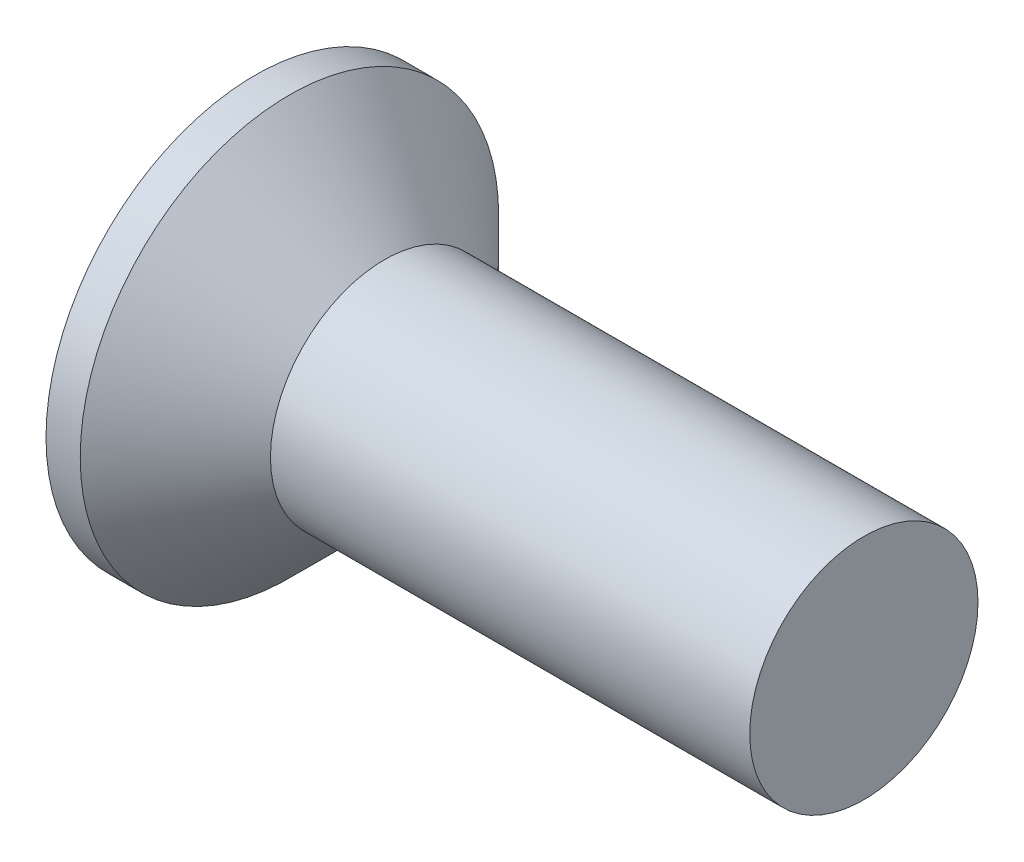
ISO-10303-21;
HEADER;
FILE_DESCRIPTION(('STEP AP214'),'2;1');
FILE_NAME('part.step','',(''),(''),'','','');
FILE_SCHEMA(('AUTOMOTIVE_DESIGN { 1 0 10303 214 1 1 1 1 }'));
ENDSEC;
DATA;
#1=APPLICATION_CONTEXT('core data for automotive mechanical design processes');
#2=APPLICATION_PROTOCOL_DEFINITION('international standard','automotive_design',2000,#1);
#3=PRODUCT_CONTEXT('',#1,'mechanical');
#4=PRODUCT('Part','Part','',(#3));
#5=PRODUCT_RELATED_PRODUCT_CATEGORY('part','',(#4));
#6=PRODUCT_DEFINITION_FORMATION('','',#4);
#7=PRODUCT_DEFINITION_CONTEXT('part definition',#1,'design');
#8=PRODUCT_DEFINITION('design','',#6,#7);
#9=PRODUCT_DEFINITION_SHAPE('','',#8);
#10=(LENGTH_UNIT() NAMED_UNIT(*) SI_UNIT(.MILLI.,.METRE.));
#11=(NAMED_UNIT(*) PLANE_ANGLE_UNIT() SI_UNIT($,.RADIAN.));
#12=(NAMED_UNIT(*) SI_UNIT($,.STERADIAN.) SOLID_ANGLE_UNIT());
#13=UNCERTAINTY_MEASURE_WITH_UNIT(LENGTH_MEASURE(1.E-05),#10,'distance_accuracy_value','');
#14=(GEOMETRIC_REPRESENTATION_CONTEXT(3) GLOBAL_UNCERTAINTY_ASSIGNED_CONTEXT((#13)) GLOBAL_UNIT_ASSIGNED_CONTEXT((#10,
#11,#12)) REPRESENTATION_CONTEXT('',''));
#15=CARTESIAN_POINT('',(0.,0.,0.));
#16=DIRECTION('',(0.,0.,1.));
#17=DIRECTION('',(1.,0.,0.));
#18=AXIS2_PLACEMENT_3D('',#15,#16,#17);
#19=CARTESIAN_POINT('',(0.,0.,0.));
#20=DIRECTION('',(-1.,0.,0.));
#21=DIRECTION('',(0.,0.,1.));
#22=AXIS2_PLACEMENT_3D('',#19,#20,#21);
#23=PLANE('',#22);
#24=CARTESIAN_POINT('',(0.,0.,0.));
#25=DIRECTION('',(-1.,0.,0.));
#26=DIRECTION('',(0.,0.,1.));
#27=AXIS2_PLACEMENT_3D('',#24,#25,#26);
#28=CIRCLE('',#27,2.75);
#29=CARTESIAN_POINT('',(0.,0.,2.75));
#30=VERTEX_POINT('',#29);
#31=EDGE_CURVE('E43',#30,#30,#28,.T.);
#32=ORIENTED_EDGE('',*,*,#31,.T.);
#33=EDGE_LOOP('',(#32));
#34=FACE_BOUND('',#33,.T.);
#35=DIRECTION('',(0.,1.,0.));
#36=VECTOR('',#35,1.);
#37=CARTESIAN_POINT('',(0.,-1.55,-0.395));
#38=LINE('',#37,#36);
#39=CARTESIAN_POINT('',(0.,-1.55,-0.395));
#40=VERTEX_POINT('',#39);
#41=CARTESIAN_POINT('',(0.,-0.394999999999999,-0.395));
#42=VERTEX_POINT('',#41);
#43=EDGE_CURVE('E104',#40,#42,#38,.T.);
#44=ORIENTED_EDGE('',*,*,#43,.T.);
#45=DIRECTION('',(0.,0.,-1.));
#46=VECTOR('',#45,1.);
#47=CARTESIAN_POINT('',(0.,-0.395000000000005,1.55));
#48=LINE('',#47,#46);
#49=CARTESIAN_POINT('',(0.,-0.394999999999995,-1.55));
#50=VERTEX_POINT('',#49);
#51=EDGE_CURVE('E84',#42,#50,#48,.T.);
#52=ORIENTED_EDGE('',*,*,#51,.T.);
#53=DIRECTION('',(0.,1.,0.));
#54=VECTOR('',#53,1.);
#55=CARTESIAN_POINT('',(0.,-0.394999999999995,-1.55));
#56=LINE('',#55,#54);
#57=CARTESIAN_POINT('',(0.,0.395000000000005,-1.55));
#58=VERTEX_POINT('',#57);
#59=EDGE_CURVE('E341',#50,#58,#56,.T.);
#60=ORIENTED_EDGE('',*,*,#59,.T.);
#61=DIRECTION('',(0.,0.,1.));
#62=VECTOR('',#61,1.);
#63=CARTESIAN_POINT('',(0.,0.395000000000005,-1.55));
#64=LINE('',#63,#62);
#65=CARTESIAN_POINT('',(0.,0.395000000000001,-0.395));
#66=VERTEX_POINT('',#65);
#67=EDGE_CURVE('E100',#58,#66,#64,.T.);
#68=ORIENTED_EDGE('',*,*,#67,.T.);
#69=CARTESIAN_POINT('',(0.,1.55,-0.395));
#70=VERTEX_POINT('',#69);
#71=EDGE_CURVE('E94',#66,#70,#38,.T.);
#72=ORIENTED_EDGE('',*,*,#71,.T.);
#73=DIRECTION('',(0.,0.,1.));
#74=VECTOR('',#73,1.);
#75=CARTESIAN_POINT('',(0.,1.55,-0.395));
#76=LINE('',#75,#74);
#77=CARTESIAN_POINT('',(0.,1.55,0.395));
#78=VERTEX_POINT('',#77);
#79=EDGE_CURVE('E97',#70,#78,#76,.T.);
#80=ORIENTED_EDGE('',*,*,#79,.T.);
#81=DIRECTION('',(0.,-1.,0.));
#82=VECTOR('',#81,1.);
#83=CARTESIAN_POINT('',(0.,1.55,0.395));
#84=LINE('',#83,#82);
#85=CARTESIAN_POINT('',(0.,0.394999999999998,0.395));
#86=VERTEX_POINT('',#85);
#87=EDGE_CURVE('E353',#78,#86,#84,.T.);
#88=ORIENTED_EDGE('',*,*,#87,.T.);
#89=CARTESIAN_POINT('',(0.,0.394999999999994,1.55));
#90=VERTEX_POINT('',#89);
#91=EDGE_CURVE('E336',#86,#90,#64,.T.);
#92=ORIENTED_EDGE('',*,*,#91,.T.);
#93=DIRECTION('',(0.,-1.,0.));
#94=VECTOR('',#93,1.);
#95=CARTESIAN_POINT('',(0.,0.394999999999994,1.55));
#96=LINE('',#95,#94);
#97=CARTESIAN_POINT('',(0.,-0.395000000000005,1.55));
#98=VERTEX_POINT('',#97);
#99=EDGE_CURVE('E322',#90,#98,#96,.T.);
#100=ORIENTED_EDGE('',*,*,#99,.T.);
#101=CARTESIAN_POINT('',(0.,-0.395000000000001,0.395));
#102=VERTEX_POINT('',#101);
#103=EDGE_CURVE('E334',#98,#102,#48,.T.);
#104=ORIENTED_EDGE('',*,*,#103,.T.);
#105=CARTESIAN_POINT('',(0.,-1.55,0.395));
#106=VERTEX_POINT('',#105);
#107=EDGE_CURVE('E110',#102,#106,#84,.T.);
#108=ORIENTED_EDGE('',*,*,#107,.T.);
#109=DIRECTION('',(0.,0.,-1.));
#110=VECTOR('',#109,1.);
#111=CARTESIAN_POINT('',(0.,-1.55,0.395));
#112=LINE('',#111,#110);
#113=EDGE_CURVE('E133',#106,#40,#112,.T.);
#114=ORIENTED_EDGE('',*,*,#113,.T.);
#115=EDGE_LOOP('',(#44,#52,#60,#68,#72,#80,#88,#92,#100,#104,#108,#114));
#116=FACE_BOUND('',#115,.T.);
#117=ADVANCED_FACE('F36',(#34,#116),#23,.T.);
#118=CARTESIAN_POINT('',(2.38373382624769,0.,0.16865988909427));
#119=DIRECTION('',(-0.0945267588569115,0.,-0.995522321125954));
#120=DIRECTION('',(-0.995522321125954,0.,0.0945267588569115));
#121=AXIS2_PLACEMENT_3D('',#118,#119,#120);
#122=PLANE('',#121);
#123=ORIENTED_EDGE('',*,*,#107,.F.);
#124=DIRECTION('',(0.991104257398676,0.0941072552097304,-0.0941072552097301));
#125=VECTOR('',#124,1.);
#126=CARTESIAN_POINT('',(2.39946475118715,-0.16716620751949,0.167166207519489));
#127=LINE('',#126,#125);
#128=CARTESIAN_POINT('',(2.08,-0.197500000000001,0.197499999999999));
#129=VERTEX_POINT('',#128);
#130=EDGE_CURVE('E128',#102,#129,#127,.T.);
#131=ORIENTED_EDGE('',*,*,#130,.T.);
#132=DIRECTION('',(0.835707904588477,0.543411029305728,-0.0793520726712617));
#133=VECTOR('',#132,1.);
#134=CARTESIAN_POINT('',(0.,-1.55,0.395));
#135=LINE('',#134,#133);
#136=EDGE_CURVE('E105',#106,#129,#135,.T.);
#137=ORIENTED_EDGE('',*,*,#136,.F.);
#138=EDGE_LOOP('',(#123,#131,#137));
#139=FACE_BOUND('',#138,.T.);
#140=ADVANCED_FACE('F156',(#139),#122,.T.);
#141=DIRECTION('',(0.835707904588477,-0.543411029305729,-0.0793520726712616));
#142=VECTOR('',#141,1.);
#143=CARTESIAN_POINT('',(0.,1.55,0.395));
#144=LINE('',#143,#142);
#145=CARTESIAN_POINT('',(2.08,0.1975,0.1975));
#146=VERTEX_POINT('',#145);
#147=EDGE_CURVE('E50',#78,#146,#144,.T.);
#148=ORIENTED_EDGE('',*,*,#147,.T.);
#149=DIRECTION('',(-0.991104257398676,0.0941072552097297,0.09410725520973));
#150=VECTOR('',#149,1.);
#151=CARTESIAN_POINT('',(2.39946475118715,0.167166207519489,0.167166207519489));
#152=LINE('',#151,#150);
#153=EDGE_CURVE('E349',#146,#86,#152,.T.);
#154=ORIENTED_EDGE('',*,*,#153,.T.);
#155=ORIENTED_EDGE('',*,*,#87,.F.);
#156=EDGE_LOOP('',(#148,#154,#155));
#157=FACE_BOUND('',#156,.T.);
#158=ADVANCED_FACE('F160',(#157),#122,.T.);
#159=CARTESIAN_POINT('',(2.38373382624769,0.,-0.16865988909427));
#160=DIRECTION('',(-0.0945267588569114,0.,0.995522321125954));
#161=DIRECTION('',(0.995522321125954,0.,0.0945267588569114));
#162=AXIS2_PLACEMENT_3D('',#159,#160,#161);
#163=PLANE('',#162);
#164=DIRECTION('',(0.835707904588477,0.543411029305729,0.0793520726712616));
#165=VECTOR('',#164,1.);
#166=CARTESIAN_POINT('',(0.,-1.55,-0.395));
#167=LINE('',#166,#165);
#168=CARTESIAN_POINT('',(2.08,-0.197499999999999,-0.197500000000001));
#169=VERTEX_POINT('',#168);
#170=EDGE_CURVE('E59',#40,#169,#167,.T.);
#171=ORIENTED_EDGE('',*,*,#170,.T.);
#172=DIRECTION('',(-0.991104257398676,-0.0941072552097297,-0.09410725520973));
#173=VECTOR('',#172,1.);
#174=CARTESIAN_POINT('',(2.39946475118715,-0.167166207519489,-0.167166207519489));
#175=LINE('',#174,#173);
#176=EDGE_CURVE('E11',#169,#42,#175,.T.);
#177=ORIENTED_EDGE('',*,*,#176,.T.);
#178=ORIENTED_EDGE('',*,*,#43,.F.);
#179=EDGE_LOOP('',(#171,#177,#178));
#180=FACE_BOUND('',#179,.T.);
#181=ADVANCED_FACE('F153',(#180),#163,.T.);
#182=ORIENTED_EDGE('',*,*,#71,.F.);
#183=DIRECTION('',(0.991104257398676,-0.0941072552097303,0.09410725520973));
#184=VECTOR('',#183,1.);
#185=CARTESIAN_POINT('',(2.39946475118715,0.16716620751949,-0.167166207519489));
#186=LINE('',#185,#184);
#187=CARTESIAN_POINT('',(2.08,0.1975,-0.1975));
#188=VERTEX_POINT('',#187);
#189=EDGE_CURVE('E113',#66,#188,#186,.T.);
#190=ORIENTED_EDGE('',*,*,#189,.T.);
#191=DIRECTION('',(0.835707904588477,-0.543411029305729,0.0793520726712616));
#192=VECTOR('',#191,1.);
#193=CARTESIAN_POINT('',(0.,1.55,-0.395));
#194=LINE('',#193,#192);
#195=EDGE_CURVE('E109',#70,#188,#194,.T.);
#196=ORIENTED_EDGE('',*,*,#195,.F.);
#197=EDGE_LOOP('',(#182,#190,#196));
#198=FACE_BOUND('',#197,.T.);
#199=ADVANCED_FACE('F112',(#198),#163,.T.);
#200=CARTESIAN_POINT('',(-6.34999999999999,0.,0.));
#201=DIRECTION('',(-1.,0.,0.));
#202=DIRECTION('',(0.,0.,1.));
#203=AXIS2_PLACEMENT_3D('',#200,#201,#202);
#204=CYLINDRICAL_SURFACE('',#203,2.75);
#205=CARTESIAN_POINT('',(0.450000000000005,0.,0.));
#206=DIRECTION('',(-1.,0.,0.));
#207=DIRECTION('',(0.,0.,1.));
#208=AXIS2_PLACEMENT_3D('',#205,#206,#207);
#209=CIRCLE('',#208,2.75);
#210=CARTESIAN_POINT('',(0.450000000000005,0.,2.75));
#211=VERTEX_POINT('',#210);
#212=EDGE_CURVE('E136',#211,#211,#209,.T.);
#213=ORIENTED_EDGE('',*,*,#212,.T.);
#214=EDGE_LOOP('',(#213));
#215=FACE_BOUND('',#214,.T.);
#216=ORIENTED_EDGE('',*,*,#31,.F.);
#217=EDGE_LOOP('',(#216));
#218=FACE_BOUND('',#217,.T.);
#219=ADVANCED_FACE('F142',(#215,#218),#204,.T.);
#220=CARTESIAN_POINT('',(0.450000000000005,0.,0.));
#221=DIRECTION('',(-1.,0.,0.));
#222=DIRECTION('',(0.,0.,1.));
#223=AXIS2_PLACEMENT_3D('',#220,#221,#222);
#224=CONICAL_SURFACE('',#223,2.75,0.78539816339745);
#225=CARTESIAN_POINT('',(1.7,0.,0.));
#226=DIRECTION('',(-1.,0.,0.));
#227=DIRECTION('',(0.,0.,1.));
#228=AXIS2_PLACEMENT_3D('',#225,#226,#227);
#229=CIRCLE('',#228,1.5);
#230=CARTESIAN_POINT('',(1.7,0.,1.5));
#231=VERTEX_POINT('',#230);
#232=EDGE_CURVE('E132',#231,#231,#229,.T.);
#233=ORIENTED_EDGE('',*,*,#232,.T.);
#234=EDGE_LOOP('',(#233));
#235=FACE_BOUND('',#234,.T.);
#236=ORIENTED_EDGE('',*,*,#212,.F.);
#237=EDGE_LOOP('',(#236));
#238=FACE_BOUND('',#237,.T.);
#239=ADVANCED_FACE('F144',(#235,#238),#224,.T.);
#240=CARTESIAN_POINT('',(-6.34999999999999,0.,0.));
#241=DIRECTION('',(-1.,0.,0.));
#242=DIRECTION('',(0.,0.,1.));
#243=AXIS2_PLACEMENT_3D('',#240,#241,#242);
#244=CYLINDRICAL_SURFACE('',#243,1.5);
#245=CARTESIAN_POINT('',(8.,0.,0.));
#246=DIRECTION('',(-1.,0.,0.));
#247=DIRECTION('',(0.,0.,1.));
#248=AXIS2_PLACEMENT_3D('',#245,#246,#247);
#249=CIRCLE('',#248,1.5);
#250=CARTESIAN_POINT('',(8.,0.,1.5));
#251=VERTEX_POINT('',#250);
#252=EDGE_CURVE('E129',#251,#251,#249,.T.);
#253=ORIENTED_EDGE('',*,*,#252,.T.);
#254=EDGE_LOOP('',(#253));
#255=FACE_BOUND('',#254,.T.);
#256=ORIENTED_EDGE('',*,*,#232,.F.);
#257=EDGE_LOOP('',(#256));
#258=FACE_BOUND('',#257,.T.);
#259=ADVANCED_FACE('F150',(#255,#258),#244,.T.);
#260=CARTESIAN_POINT('',(8.,1.5,0.));
#261=DIRECTION('',(1.,0.,0.));
#262=DIRECTION('',(0.,0.,-1.));
#263=AXIS2_PLACEMENT_3D('',#260,#261,#262);
#264=PLANE('',#263);
#265=ORIENTED_EDGE('',*,*,#252,.F.);
#266=EDGE_LOOP('',(#265));
#267=FACE_BOUND('',#266,.T.);
#268=ADVANCED_FACE('F180',(#267),#264,.T.);
#269=CARTESIAN_POINT('',(2.08,0.1975,-0.1975));
#270=DIRECTION('',(1.,0.,0.));
#271=DIRECTION('',(0.,0.,-1.));
#272=AXIS2_PLACEMENT_3D('',#269,#270,#271);
#273=PLANE('',#272);
#274=DIRECTION('',(0.,1.,0.));
#275=VECTOR('',#274,1.);
#276=CARTESIAN_POINT('',(2.08,-0.1975,-0.1975));
#277=LINE('',#276,#275);
#278=EDGE_CURVE('E124',#169,#188,#277,.T.);
#279=ORIENTED_EDGE('',*,*,#278,.F.);
#280=DIRECTION('',(0.,0.,-1.));
#281=VECTOR('',#280,1.);
#282=CARTESIAN_POINT('',(2.08,-0.1975,0.1975));
#283=LINE('',#282,#281);
#284=EDGE_CURVE('E115',#129,#169,#283,.T.);
#285=ORIENTED_EDGE('',*,*,#284,.F.);
#286=DIRECTION('',(0.,-1.,0.));
#287=VECTOR('',#286,1.);
#288=CARTESIAN_POINT('',(2.08,0.1975,0.1975));
#289=LINE('',#288,#287);
#290=EDGE_CURVE('E118',#146,#129,#289,.T.);
#291=ORIENTED_EDGE('',*,*,#290,.F.);
#292=DIRECTION('',(0.,0.,1.));
#293=VECTOR('',#292,1.);
#294=CARTESIAN_POINT('',(2.08,0.1975,-0.1975));
#295=LINE('',#294,#293);
#296=EDGE_CURVE('E122',#188,#146,#295,.T.);
#297=ORIENTED_EDGE('',*,*,#296,.F.);
#298=EDGE_LOOP('',(#279,#285,#291,#297));
#299=FACE_BOUND('',#298,.T.);
#300=ADVANCED_FACE('F177',(#299),#273,.F.);
#301=CARTESIAN_POINT('',(0.,-1.55,-0.395));
#302=DIRECTION('',(-0.54513001368185,0.838351518268576,0.));
#303=DIRECTION('',(-0.838351518268576,-0.54513001368185,0.));
#304=AXIS2_PLACEMENT_3D('',#301,#302,#303);
#305=PLANE('',#304);
#306=ORIENTED_EDGE('',*,*,#170,.F.);
#307=ORIENTED_EDGE('',*,*,#113,.F.);
#308=ORIENTED_EDGE('',*,*,#136,.T.);
#309=ORIENTED_EDGE('',*,*,#284,.T.);
#310=EDGE_LOOP('',(#306,#307,#308,#309));
#311=FACE_BOUND('',#310,.T.);
#312=ADVANCED_FACE('F169',(#311),#305,.T.);
#313=CARTESIAN_POINT('',(0.,1.55,0.395));
#314=DIRECTION('',(-0.54513001368185,-0.838351518268576,0.));
#315=DIRECTION('',(0.838351518268576,-0.54513001368185,0.));
#316=AXIS2_PLACEMENT_3D('',#313,#314,#315);
#317=PLANE('',#316);
#318=ORIENTED_EDGE('',*,*,#147,.F.);
#319=ORIENTED_EDGE('',*,*,#79,.F.);
#320=ORIENTED_EDGE('',*,*,#195,.T.);
#321=ORIENTED_EDGE('',*,*,#296,.T.);
#322=EDGE_LOOP('',(#318,#319,#320,#321));
#323=FACE_BOUND('',#322,.T.);
#324=ADVANCED_FACE('F108',(#323),#317,.T.);
#325=CARTESIAN_POINT('',(2.38373382624769,-0.16865988909427,0.));
#326=DIRECTION('',(-0.0945267588569115,0.995522321125954,0.));
#327=DIRECTION('',(-0.995522321125954,-0.0945267588569115,0.));
#328=AXIS2_PLACEMENT_3D('',#325,#326,#327);
#329=PLANE('',#328);
#330=DIRECTION('',(0.835707904588477,0.0793520726712598,0.543411029305729));
#331=VECTOR('',#330,1.);
#332=CARTESIAN_POINT('',(0.,-0.394999999999995,-1.55));
#333=LINE('',#332,#331);
#334=EDGE_CURVE('E343',#50,#169,#333,.T.);
#335=ORIENTED_EDGE('',*,*,#334,.F.);
#336=ORIENTED_EDGE('',*,*,#51,.F.);
#337=ORIENTED_EDGE('',*,*,#176,.F.);
#338=EDGE_LOOP('',(#335,#336,#337));
#339=FACE_BOUND('',#338,.T.);
#340=ADVANCED_FACE('F176',(#339),#329,.T.);
#341=CARTESIAN_POINT('',(2.38373382624769,0.16865988909427,0.));
#342=DIRECTION('',(-0.0945267588569114,-0.995522321125954,0.));
#343=DIRECTION('',(0.995522321125954,-0.0945267588569114,0.));
#344=AXIS2_PLACEMENT_3D('',#341,#342,#343);
#345=PLANE('',#344);
#346=ORIENTED_EDGE('',*,*,#67,.F.);
#347=DIRECTION('',(0.835707904588477,-0.0793520726712635,0.543411029305728));
#348=VECTOR('',#347,1.);
#349=CARTESIAN_POINT('',(0.,0.395000000000005,-1.55));
#350=LINE('',#349,#348);
#351=EDGE_CURVE('E75',#58,#188,#350,.T.);
#352=ORIENTED_EDGE('',*,*,#351,.T.);
#353=ORIENTED_EDGE('',*,*,#189,.F.);
#354=EDGE_LOOP('',(#346,#352,#353));
#355=FACE_BOUND('',#354,.T.);
#356=ADVANCED_FACE('F220',(#355),#345,.T.);
#357=CARTESIAN_POINT('',(0.,0.395000000000005,-1.55));
#358=DIRECTION('',(-0.54513001368185,0.,0.838351518268576));
#359=DIRECTION('',(-0.838351518268576,0.,-0.54513001368185));
#360=AXIS2_PLACEMENT_3D('',#357,#358,#359);
#361=PLANE('',#360);
#362=ORIENTED_EDGE('',*,*,#351,.F.);
#363=ORIENTED_EDGE('',*,*,#59,.F.);
#364=ORIENTED_EDGE('',*,*,#334,.T.);
#365=ORIENTED_EDGE('',*,*,#278,.T.);
#366=EDGE_LOOP('',(#362,#363,#364,#365));
#367=FACE_BOUND('',#366,.T.);
#368=ADVANCED_FACE('F228',(#367),#361,.T.);
#369=ORIENTED_EDGE('',*,*,#103,.F.);
#370=DIRECTION('',(0.835707904588477,0.0793520726712635,-0.543411029305728));
#371=VECTOR('',#370,1.);
#372=CARTESIAN_POINT('',(0.,-0.395000000000005,1.55));
#373=LINE('',#372,#371);
#374=EDGE_CURVE('E319',#98,#129,#373,.T.);
#375=ORIENTED_EDGE('',*,*,#374,.T.);
#376=ORIENTED_EDGE('',*,*,#130,.F.);
#377=EDGE_LOOP('',(#369,#375,#376));
#378=FACE_BOUND('',#377,.T.);
#379=ADVANCED_FACE('F222',(#378),#329,.T.);
#380=DIRECTION('',(0.835707904588477,-0.0793520726712597,-0.543411029305729));
#381=VECTOR('',#380,1.);
#382=CARTESIAN_POINT('',(0.,0.394999999999994,1.55));
#383=LINE('',#382,#381);
#384=EDGE_CURVE('E330',#90,#146,#383,.T.);
#385=ORIENTED_EDGE('',*,*,#384,.F.);
#386=ORIENTED_EDGE('',*,*,#91,.F.);
#387=ORIENTED_EDGE('',*,*,#153,.F.);
#388=EDGE_LOOP('',(#385,#386,#387));
#389=FACE_BOUND('',#388,.T.);
#390=ADVANCED_FACE('F230',(#389),#345,.T.);
#391=CARTESIAN_POINT('',(0.,-0.395000000000005,1.55));
#392=DIRECTION('',(-0.54513001368185,0.,-0.838351518268576));
#393=DIRECTION('',(0.838351518268576,0.,-0.54513001368185));
#394=AXIS2_PLACEMENT_3D('',#391,#392,#393);
#395=PLANE('',#394);
#396=ORIENTED_EDGE('',*,*,#374,.F.);
#397=ORIENTED_EDGE('',*,*,#99,.F.);
#398=ORIENTED_EDGE('',*,*,#384,.T.);
#399=ORIENTED_EDGE('',*,*,#290,.T.);
#400=EDGE_LOOP('',(#396,#397,#398,#399));
#401=FACE_BOUND('',#400,.T.);
#402=ADVANCED_FACE('F249',(#401),#395,.T.);
#403=CLOSED_SHELL('',(#117,#140,#158,#181,#199,#219,#239,#259,#268,#300,#312,#324,#340,#356,
#368,#379,#390,#402));
#404=MANIFOLD_SOLID_BREP('B2',#403);
#405=ADVANCED_BREP_SHAPE_REPRESENTATION('',(#18,#404),#14);
#406=SHAPE_DEFINITION_REPRESENTATION(#9,#405);
ENDSEC;
END-ISO-10303-21;
